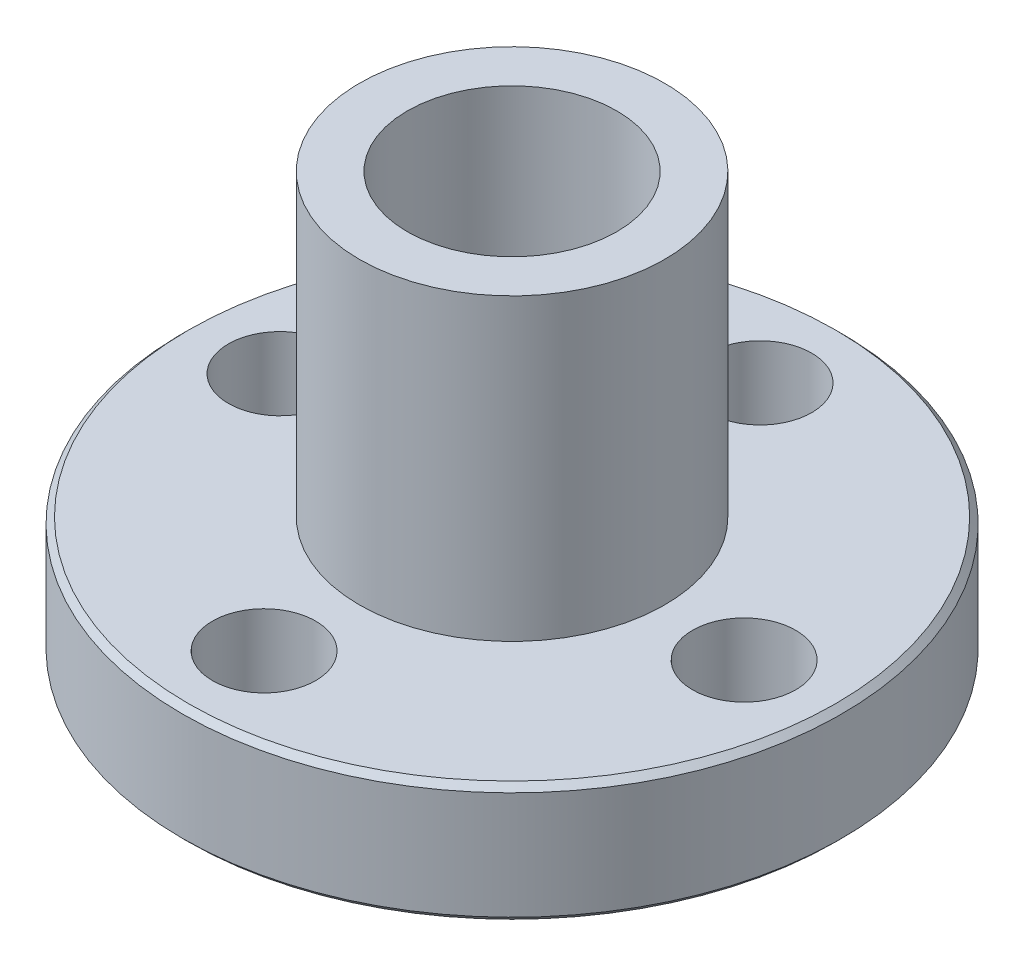
ISO-10303-21;
HEADER;
FILE_DESCRIPTION(('STEP AP214'),'2;1');
FILE_NAME('part.step','',(''),(''),'','','');
FILE_SCHEMA(('AUTOMOTIVE_DESIGN { 1 0 10303 214 1 1 1 1 }'));
ENDSEC;
DATA;
#1=APPLICATION_CONTEXT('core data for automotive mechanical design processes');
#2=APPLICATION_PROTOCOL_DEFINITION('international standard','automotive_design',2000,#1);
#3=PRODUCT_CONTEXT('',#1,'mechanical');
#4=PRODUCT('Part','Part','',(#3));
#5=PRODUCT_RELATED_PRODUCT_CATEGORY('part','',(#4));
#6=PRODUCT_DEFINITION_FORMATION('','',#4);
#7=PRODUCT_DEFINITION_CONTEXT('part definition',#1,'design');
#8=PRODUCT_DEFINITION('design','',#6,#7);
#9=PRODUCT_DEFINITION_SHAPE('','',#8);
#10=(LENGTH_UNIT() NAMED_UNIT(*) SI_UNIT(.MILLI.,.METRE.));
#11=(NAMED_UNIT(*) PLANE_ANGLE_UNIT() SI_UNIT($,.RADIAN.));
#12=(NAMED_UNIT(*) SI_UNIT($,.STERADIAN.) SOLID_ANGLE_UNIT());
#13=UNCERTAINTY_MEASURE_WITH_UNIT(LENGTH_MEASURE(1.E-05),#10,'distance_accuracy_value','');
#14=(GEOMETRIC_REPRESENTATION_CONTEXT(3) GLOBAL_UNCERTAINTY_ASSIGNED_CONTEXT((#13)) GLOBAL_UNIT_ASSIGNED_CONTEXT((#10,
#11,#12)) REPRESENTATION_CONTEXT('',''));
#15=CARTESIAN_POINT('',(0.,0.,0.));
#16=DIRECTION('',(0.,0.,1.));
#17=DIRECTION('',(1.,0.,0.));
#18=AXIS2_PLACEMENT_3D('',#15,#16,#17);
#19=CARTESIAN_POINT('',(0.,0.,0.));
#20=DIRECTION('',(0.,1.,0.));
#21=DIRECTION('',(0.,0.,1.));
#22=AXIS2_PLACEMENT_3D('',#19,#20,#21);
#23=PLANE('',#22);
#24=CARTESIAN_POINT('',(0.,0.,0.));
#25=DIRECTION('',(0.,1.,0.));
#26=DIRECTION('',(0.,0.,1.));
#27=AXIS2_PLACEMENT_3D('',#24,#25,#26);
#28=CIRCLE('',#27,10.8129526367968);
#29=CARTESIAN_POINT('',(0.,0.,10.8129526367968));
#30=VERTEX_POINT('',#29);
#31=EDGE_CURVE('E37',#30,#30,#28,.F.);
#32=ORIENTED_EDGE('',*,*,#31,.T.);
#33=EDGE_LOOP('',(#32));
#34=FACE_BOUND('',#33,.T.);
#35=CARTESIAN_POINT('',(8.0205800835759,0.,0.266308323087465));
#36=DIRECTION('',(0.,1.,0.));
#37=DIRECTION('',(0.,0.,1.));
#38=AXIS2_PLACEMENT_3D('',#35,#36,#37);
#39=CIRCLE('',#38,1.725);
#40=CARTESIAN_POINT('',(8.0205800835759,0.,1.99130832308747));
#41=VERTEX_POINT('',#40);
#42=EDGE_CURVE('E53',#41,#41,#39,.T.);
#43=ORIENTED_EDGE('',*,*,#42,.T.);
#44=EDGE_LOOP('',(#43));
#45=FACE_BOUND('',#44,.T.);
#46=CARTESIAN_POINT('',(-0.266308323087465,0.,8.0205800835759));
#47=DIRECTION('',(0.,1.,0.));
#48=DIRECTION('',(0.,0.,1.));
#49=AXIS2_PLACEMENT_3D('',#46,#47,#48);
#50=CIRCLE('',#49,1.725);
#51=CARTESIAN_POINT('',(-0.266308323087465,0.,9.7455800835759));
#52=VERTEX_POINT('',#51);
#53=EDGE_CURVE('E57',#52,#52,#50,.T.);
#54=ORIENTED_EDGE('',*,*,#53,.T.);
#55=EDGE_LOOP('',(#54));
#56=FACE_BOUND('',#55,.T.);
#57=CARTESIAN_POINT('',(-8.0205800835759,0.,-0.266308323087464));
#58=DIRECTION('',(0.,1.,0.));
#59=DIRECTION('',(0.,0.,1.));
#60=AXIS2_PLACEMENT_3D('',#57,#58,#59);
#61=CIRCLE('',#60,1.725);
#62=CARTESIAN_POINT('',(-8.0205800835759,0.,1.45869167691254));
#63=VERTEX_POINT('',#62);
#64=EDGE_CURVE('E63',#63,#63,#61,.T.);
#65=ORIENTED_EDGE('',*,*,#64,.T.);
#66=EDGE_LOOP('',(#65));
#67=FACE_BOUND('',#66,.T.);
#68=CARTESIAN_POINT('',(0.266308323087464,0.,-8.0205800835759));
#69=DIRECTION('',(0.,1.,0.));
#70=DIRECTION('',(0.,0.,1.));
#71=AXIS2_PLACEMENT_3D('',#68,#69,#70);
#72=CIRCLE('',#71,1.725);
#73=CARTESIAN_POINT('',(0.266308323087464,0.,-6.29558008357589));
#74=VERTEX_POINT('',#73);
#75=EDGE_CURVE('E69',#74,#74,#72,.T.);
#76=ORIENTED_EDGE('',*,*,#75,.T.);
#77=EDGE_LOOP('',(#76));
#78=FACE_BOUND('',#77,.T.);
#79=CARTESIAN_POINT('',(0.,0.,0.));
#80=DIRECTION('',(0.,1.,0.));
#81=DIRECTION('',(0.,0.,1.));
#82=AXIS2_PLACEMENT_3D('',#79,#80,#81);
#83=CIRCLE('',#82,5.125);
#84=CARTESIAN_POINT('',(0.,0.,5.125));
#85=VERTEX_POINT('',#84);
#86=EDGE_CURVE('E50',#85,#85,#83,.F.);
#87=ORIENTED_EDGE('',*,*,#86,.F.);
#88=EDGE_LOOP('',(#87));
#89=FACE_BOUND('',#88,.T.);
#90=ADVANCED_FACE('F30',(#34,#45,#56,#67,#78,#89),#23,.F.);
#91=CARTESIAN_POINT('',(0.,4.,0.));
#92=DIRECTION('',(0.,1.,0.));
#93=DIRECTION('',(0.,0.,1.));
#94=AXIS2_PLACEMENT_3D('',#91,#92,#93);
#95=PLANE('',#94);
#96=CARTESIAN_POINT('',(0.,4.,0.));
#97=DIRECTION('',(0.,1.,0.));
#98=DIRECTION('',(0.,0.,1.));
#99=AXIS2_PLACEMENT_3D('',#96,#97,#98);
#100=CIRCLE('',#99,10.8129526367968);
#101=CARTESIAN_POINT('',(0.,4.,10.8129526367968));
#102=VERTEX_POINT('',#101);
#103=EDGE_CURVE('E10',#102,#102,#100,.T.);
#104=ORIENTED_EDGE('',*,*,#103,.T.);
#105=EDGE_LOOP('',(#104));
#106=FACE_BOUND('',#105,.T.);
#107=CARTESIAN_POINT('',(8.0205800835759,4.,0.266308323087465));
#108=DIRECTION('',(0.,1.,0.));
#109=DIRECTION('',(0.,0.,1.));
#110=AXIS2_PLACEMENT_3D('',#107,#108,#109);
#111=CIRCLE('',#110,1.725);
#112=CARTESIAN_POINT('',(8.0205800835759,4.,1.99130832308747));
#113=VERTEX_POINT('',#112);
#114=EDGE_CURVE('E54',#113,#113,#111,.T.);
#115=ORIENTED_EDGE('',*,*,#114,.F.);
#116=EDGE_LOOP('',(#115));
#117=FACE_BOUND('',#116,.T.);
#118=CARTESIAN_POINT('',(-0.266308323087465,4.,8.0205800835759));
#119=DIRECTION('',(0.,1.,0.));
#120=DIRECTION('',(0.,0.,1.));
#121=AXIS2_PLACEMENT_3D('',#118,#119,#120);
#122=CIRCLE('',#121,1.725);
#123=CARTESIAN_POINT('',(-0.266308323087465,4.,9.7455800835759));
#124=VERTEX_POINT('',#123);
#125=EDGE_CURVE('E60',#124,#124,#122,.T.);
#126=ORIENTED_EDGE('',*,*,#125,.F.);
#127=EDGE_LOOP('',(#126));
#128=FACE_BOUND('',#127,.T.);
#129=CARTESIAN_POINT('',(-8.0205800835759,4.,-0.266308323087464));
#130=DIRECTION('',(0.,1.,0.));
#131=DIRECTION('',(0.,0.,1.));
#132=AXIS2_PLACEMENT_3D('',#129,#130,#131);
#133=CIRCLE('',#132,1.725);
#134=CARTESIAN_POINT('',(-8.0205800835759,4.,1.45869167691254));
#135=VERTEX_POINT('',#134);
#136=EDGE_CURVE('E66',#135,#135,#133,.T.);
#137=ORIENTED_EDGE('',*,*,#136,.F.);
#138=EDGE_LOOP('',(#137));
#139=FACE_BOUND('',#138,.T.);
#140=CARTESIAN_POINT('',(0.266308323087464,4.,-8.0205800835759));
#141=DIRECTION('',(0.,1.,0.));
#142=DIRECTION('',(0.,0.,1.));
#143=AXIS2_PLACEMENT_3D('',#140,#141,#142);
#144=CIRCLE('',#143,1.725);
#145=CARTESIAN_POINT('',(0.266308323087464,4.,-6.29558008357589));
#146=VERTEX_POINT('',#145);
#147=EDGE_CURVE('E72',#146,#146,#144,.T.);
#148=ORIENTED_EDGE('',*,*,#147,.F.);
#149=EDGE_LOOP('',(#148));
#150=FACE_BOUND('',#149,.T.);
#151=CARTESIAN_POINT('',(0.,4.,0.));
#152=DIRECTION('',(0.,1.,0.));
#153=DIRECTION('',(0.,0.,1.));
#154=AXIS2_PLACEMENT_3D('',#151,#152,#153);
#155=CIRCLE('',#154,5.1);
#156=CARTESIAN_POINT('',(0.,4.,5.1));
#157=VERTEX_POINT('',#156);
#158=EDGE_CURVE('E78',#157,#157,#155,.T.);
#159=ORIENTED_EDGE('',*,*,#158,.F.);
#160=EDGE_LOOP('',(#159));
#161=FACE_BOUND('',#160,.T.);
#162=ADVANCED_FACE('F112',(#106,#117,#128,#139,#150,#161),#95,.T.);
#163=CARTESIAN_POINT('',(0.,4.,0.));
#164=DIRECTION('',(0.,-1.,0.));
#165=DIRECTION('',(0.,0.,-1.));
#166=AXIS2_PLACEMENT_3D('',#163,#164,#165);
#167=CYLINDRICAL_SURFACE('',#166,11.0129526367968);
#168=CARTESIAN_POINT('',(0.,0.200000000000001,0.));
#169=DIRECTION('',(0.,1.,0.));
#170=DIRECTION('',(0.,0.,1.));
#171=AXIS2_PLACEMENT_3D('',#168,#169,#170);
#172=CIRCLE('',#171,11.0129526367968);
#173=CARTESIAN_POINT('',(0.,0.200000000000001,11.0129526367968));
#174=VERTEX_POINT('',#173);
#175=EDGE_CURVE('E41',#174,#174,#172,.T.);
#176=ORIENTED_EDGE('',*,*,#175,.T.);
#177=EDGE_LOOP('',(#176));
#178=FACE_BOUND('',#177,.T.);
#179=CARTESIAN_POINT('',(0.,3.8,0.));
#180=DIRECTION('',(0.,1.,0.));
#181=DIRECTION('',(0.,0.,1.));
#182=AXIS2_PLACEMENT_3D('',#179,#180,#181);
#183=CIRCLE('',#182,11.0129526367968);
#184=CARTESIAN_POINT('',(0.,3.8,11.0129526367968));
#185=VERTEX_POINT('',#184);
#186=EDGE_CURVE('E45',#185,#185,#183,.F.);
#187=ORIENTED_EDGE('',*,*,#186,.T.);
#188=EDGE_LOOP('',(#187));
#189=FACE_BOUND('',#188,.T.);
#190=ADVANCED_FACE('F117',(#178,#189),#167,.T.);
#191=CARTESIAN_POINT('',(0.,4.,0.));
#192=DIRECTION('',(0.,-1.,0.));
#193=DIRECTION('',(0.,0.,-1.));
#194=AXIS2_PLACEMENT_3D('',#191,#192,#193);
#195=CYLINDRICAL_SURFACE('',#194,3.5);
#196=CARTESIAN_POINT('',(0.,14.,0.));
#197=DIRECTION('',(0.,1.,0.));
#198=DIRECTION('',(0.,0.,1.));
#199=AXIS2_PLACEMENT_3D('',#196,#197,#198);
#200=CIRCLE('',#199,3.5);
#201=CARTESIAN_POINT('',(0.,14.,3.5));
#202=VERTEX_POINT('',#201);
#203=EDGE_CURVE('E81',#202,#202,#200,.T.);
#204=ORIENTED_EDGE('',*,*,#203,.T.);
#205=EDGE_LOOP('',(#204));
#206=FACE_BOUND('',#205,.T.);
#207=CARTESIAN_POINT('',(0.,-1.25,0.));
#208=DIRECTION('',(0.,-1.,0.));
#209=DIRECTION('',(0.,0.,-1.));
#210=AXIS2_PLACEMENT_3D('',#207,#208,#209);
#211=CIRCLE('',#210,3.5);
#212=CARTESIAN_POINT('',(0.,-1.25,-3.5));
#213=VERTEX_POINT('',#212);
#214=EDGE_CURVE('E89',#213,#213,#211,.T.);
#215=ORIENTED_EDGE('',*,*,#214,.T.);
#216=EDGE_LOOP('',(#215));
#217=FACE_BOUND('',#216,.T.);
#218=ADVANCED_FACE('F93',(#206,#217),#195,.F.);
#219=CARTESIAN_POINT('',(8.0205800835759,0.,0.266308323087465));
#220=DIRECTION('',(0.,1.,0.));
#221=DIRECTION('',(0.,0.,1.));
#222=AXIS2_PLACEMENT_3D('',#219,#220,#221);
#223=CYLINDRICAL_SURFACE('',#222,1.725);
#224=ORIENTED_EDGE('',*,*,#42,.F.);
#225=EDGE_LOOP('',(#224));
#226=FACE_BOUND('',#225,.T.);
#227=ORIENTED_EDGE('',*,*,#114,.T.);
#228=EDGE_LOOP('',(#227));
#229=FACE_BOUND('',#228,.T.);
#230=ADVANCED_FACE('F180',(#226,#229),#223,.F.);
#231=CARTESIAN_POINT('',(-0.266308323087465,0.,8.0205800835759));
#232=DIRECTION('',(0.,1.,0.));
#233=DIRECTION('',(0.,0.,1.));
#234=AXIS2_PLACEMENT_3D('',#231,#232,#233);
#235=CYLINDRICAL_SURFACE('',#234,1.725);
#236=ORIENTED_EDGE('',*,*,#53,.F.);
#237=EDGE_LOOP('',(#236));
#238=FACE_BOUND('',#237,.T.);
#239=ORIENTED_EDGE('',*,*,#125,.T.);
#240=EDGE_LOOP('',(#239));
#241=FACE_BOUND('',#240,.T.);
#242=ADVANCED_FACE('F214',(#238,#241),#235,.F.);
#243=CARTESIAN_POINT('',(-8.0205800835759,0.,-0.266308323087464));
#244=DIRECTION('',(0.,1.,0.));
#245=DIRECTION('',(0.,0.,1.));
#246=AXIS2_PLACEMENT_3D('',#243,#244,#245);
#247=CYLINDRICAL_SURFACE('',#246,1.725);
#248=ORIENTED_EDGE('',*,*,#64,.F.);
#249=EDGE_LOOP('',(#248));
#250=FACE_BOUND('',#249,.T.);
#251=ORIENTED_EDGE('',*,*,#136,.T.);
#252=EDGE_LOOP('',(#251));
#253=FACE_BOUND('',#252,.T.);
#254=ADVANCED_FACE('F204',(#250,#253),#247,.F.);
#255=CARTESIAN_POINT('',(0.266308323087464,0.,-8.0205800835759));
#256=DIRECTION('',(0.,1.,0.));
#257=DIRECTION('',(0.,0.,1.));
#258=AXIS2_PLACEMENT_3D('',#255,#256,#257);
#259=CYLINDRICAL_SURFACE('',#258,1.725);
#260=ORIENTED_EDGE('',*,*,#75,.F.);
#261=EDGE_LOOP('',(#260));
#262=FACE_BOUND('',#261,.T.);
#263=ORIENTED_EDGE('',*,*,#147,.T.);
#264=EDGE_LOOP('',(#263));
#265=FACE_BOUND('',#264,.T.);
#266=ADVANCED_FACE('F195',(#262,#265),#259,.F.);
#267=CARTESIAN_POINT('',(0.,14.,0.));
#268=DIRECTION('',(0.,1.,0.));
#269=DIRECTION('',(0.,0.,1.));
#270=AXIS2_PLACEMENT_3D('',#267,#268,#269);
#271=PLANE('',#270);
#272=CARTESIAN_POINT('',(0.,14.,0.));
#273=DIRECTION('',(0.,1.,0.));
#274=DIRECTION('',(0.,0.,1.));
#275=AXIS2_PLACEMENT_3D('',#272,#273,#274);
#276=CIRCLE('',#275,5.1);
#277=CARTESIAN_POINT('',(0.,14.,5.1));
#278=VERTEX_POINT('',#277);
#279=EDGE_CURVE('E75',#278,#278,#276,.T.);
#280=ORIENTED_EDGE('',*,*,#279,.T.);
#281=EDGE_LOOP('',(#280));
#282=FACE_BOUND('',#281,.T.);
#283=ORIENTED_EDGE('',*,*,#203,.F.);
#284=EDGE_LOOP('',(#283));
#285=FACE_BOUND('',#284,.T.);
#286=ADVANCED_FACE('F108',(#282,#285),#271,.T.);
#287=CARTESIAN_POINT('',(0.,14.,0.));
#288=DIRECTION('',(0.,-1.,0.));
#289=DIRECTION('',(0.,0.,-1.));
#290=AXIS2_PLACEMENT_3D('',#287,#288,#289);
#291=CYLINDRICAL_SURFACE('',#290,5.1);
#292=ORIENTED_EDGE('',*,*,#279,.F.);
#293=EDGE_LOOP('',(#292));
#294=FACE_BOUND('',#293,.T.);
#295=ORIENTED_EDGE('',*,*,#158,.T.);
#296=EDGE_LOOP('',(#295));
#297=FACE_BOUND('',#296,.T.);
#298=ADVANCED_FACE('F98',(#294,#297),#291,.T.);
#299=CARTESIAN_POINT('',(0.,-1.25,0.));
#300=DIRECTION('',(0.,-1.,0.));
#301=DIRECTION('',(0.,0.,-1.));
#302=AXIS2_PLACEMENT_3D('',#299,#300,#301);
#303=PLANE('',#302);
#304=CARTESIAN_POINT('',(0.,-1.25,0.));
#305=DIRECTION('',(0.,-1.,0.));
#306=DIRECTION('',(0.,0.,-1.));
#307=AXIS2_PLACEMENT_3D('',#304,#305,#306);
#308=CIRCLE('',#307,5.125);
#309=CARTESIAN_POINT('',(0.,-1.25,-5.125));
#310=VERTEX_POINT('',#309);
#311=EDGE_CURVE('E86',#310,#310,#308,.T.);
#312=ORIENTED_EDGE('',*,*,#311,.T.);
#313=EDGE_LOOP('',(#312));
#314=FACE_BOUND('',#313,.T.);
#315=ORIENTED_EDGE('',*,*,#214,.F.);
#316=EDGE_LOOP('',(#315));
#317=FACE_BOUND('',#316,.T.);
#318=ADVANCED_FACE('F95',(#314,#317),#303,.T.);
#319=CARTESIAN_POINT('',(0.,-1.25,0.));
#320=DIRECTION('',(0.,1.,0.));
#321=DIRECTION('',(0.,0.,1.));
#322=AXIS2_PLACEMENT_3D('',#319,#320,#321);
#323=CYLINDRICAL_SURFACE('',#322,5.125);
#324=ORIENTED_EDGE('',*,*,#311,.F.);
#325=EDGE_LOOP('',(#324));
#326=FACE_BOUND('',#325,.T.);
#327=ORIENTED_EDGE('',*,*,#86,.T.);
#328=EDGE_LOOP('',(#327));
#329=FACE_BOUND('',#328,.T.);
#330=ADVANCED_FACE('F97',(#326,#329),#323,.T.);
#331=CARTESIAN_POINT('',(0.,0.200000000000001,0.));
#332=DIRECTION('',(0.,1.,0.));
#333=DIRECTION('',(0.,0.,1.));
#334=AXIS2_PLACEMENT_3D('',#331,#332,#333);
#335=CONICAL_SURFACE('',#334,11.0129526367968,0.785398163397453);
#336=ORIENTED_EDGE('',*,*,#31,.F.);
#337=EDGE_LOOP('',(#336));
#338=FACE_BOUND('',#337,.T.);
#339=ORIENTED_EDGE('',*,*,#175,.F.);
#340=EDGE_LOOP('',(#339));
#341=FACE_BOUND('',#340,.T.);
#342=ADVANCED_FACE('F105',(#338,#341),#335,.T.);
#343=CARTESIAN_POINT('',(0.,4.,0.));
#344=DIRECTION('',(0.,-1.,0.));
#345=DIRECTION('',(0.,0.,-1.));
#346=AXIS2_PLACEMENT_3D('',#343,#344,#345);
#347=CONICAL_SURFACE('',#346,10.8129526367968,0.785398163397448);
#348=ORIENTED_EDGE('',*,*,#186,.F.);
#349=EDGE_LOOP('',(#348));
#350=FACE_BOUND('',#349,.T.);
#351=ORIENTED_EDGE('',*,*,#103,.F.);
#352=EDGE_LOOP('',(#351));
#353=FACE_BOUND('',#352,.T.);
#354=ADVANCED_FACE('F32',(#350,#353),#347,.T.);
#355=CLOSED_SHELL('',(#90,#162,#190,#218,#230,#242,#254,#266,#286,#298,#318,#330,#342,#354));
#356=MANIFOLD_SOLID_BREP('B2',#355);
#357=ADVANCED_BREP_SHAPE_REPRESENTATION('',(#18,#356),#14);
#358=SHAPE_DEFINITION_REPRESENTATION(#9,#357);
ENDSEC;
END-ISO-10303-21;
